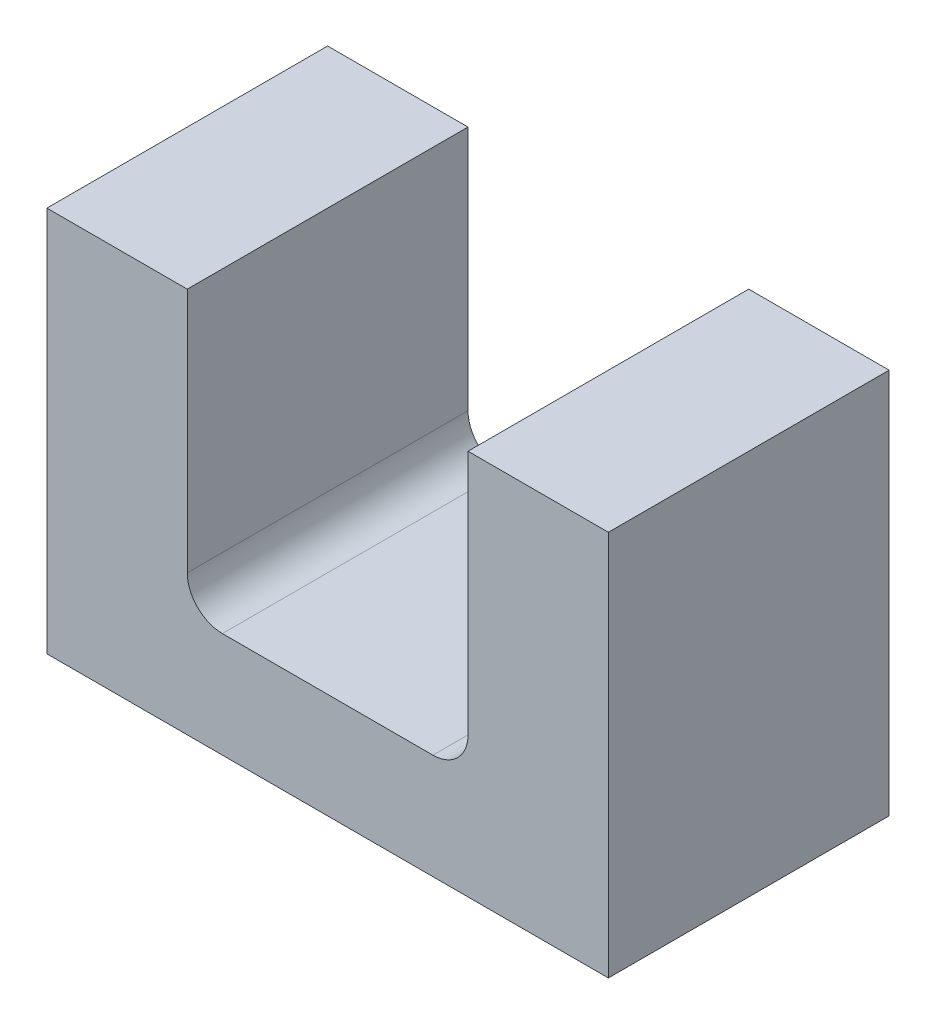
ISO-10303-21;
HEADER;
FILE_DESCRIPTION(('STEP AP214'),'2;1');
FILE_NAME('part.step','',(''),(''),'','','');
FILE_SCHEMA(('AUTOMOTIVE_DESIGN { 1 0 10303 214 1 1 1 1 }'));
ENDSEC;
DATA;
#1=APPLICATION_CONTEXT('core data for automotive mechanical design processes');
#2=APPLICATION_PROTOCOL_DEFINITION('international standard','automotive_design',2000,#1);
#3=PRODUCT_CONTEXT('',#1,'mechanical');
#4=PRODUCT('Part','Part','',(#3));
#5=PRODUCT_RELATED_PRODUCT_CATEGORY('part','',(#4));
#6=PRODUCT_DEFINITION_FORMATION('','',#4);
#7=PRODUCT_DEFINITION_CONTEXT('part definition',#1,'design');
#8=PRODUCT_DEFINITION('design','',#6,#7);
#9=PRODUCT_DEFINITION_SHAPE('','',#8);
#10=(LENGTH_UNIT() NAMED_UNIT(*) SI_UNIT(.MILLI.,.METRE.));
#11=(NAMED_UNIT(*) PLANE_ANGLE_UNIT() SI_UNIT($,.RADIAN.));
#12=(NAMED_UNIT(*) SI_UNIT($,.STERADIAN.) SOLID_ANGLE_UNIT());
#13=UNCERTAINTY_MEASURE_WITH_UNIT(LENGTH_MEASURE(1.E-05),#10,'distance_accuracy_value','');
#14=(GEOMETRIC_REPRESENTATION_CONTEXT(3) GLOBAL_UNCERTAINTY_ASSIGNED_CONTEXT((#13)) GLOBAL_UNIT_ASSIGNED_CONTEXT((#10,
#11,#12)) REPRESENTATION_CONTEXT('',''));
#15=CARTESIAN_POINT('',(0.,0.,0.));
#16=DIRECTION('',(0.,0.,1.));
#17=DIRECTION('',(1.,0.,0.));
#18=AXIS2_PLACEMENT_3D('',#15,#16,#17);
#19=CARTESIAN_POINT('',(-4.,5.5,0.));
#20=DIRECTION('',(1.,0.,0.));
#21=DIRECTION('',(0.,0.,-1.));
#22=AXIS2_PLACEMENT_3D('',#19,#20,#21);
#23=PLANE('',#22);
#24=DIRECTION('',(0.,0.,1.));
#25=VECTOR('',#24,1.);
#26=CARTESIAN_POINT('',(-4.,0.,0.));
#27=LINE('',#26,#25);
#28=CARTESIAN_POINT('',(-4.,0.,-2.));
#29=VERTEX_POINT('',#28);
#30=CARTESIAN_POINT('',(-4.,0.,2.));
#31=VERTEX_POINT('',#30);
#32=EDGE_CURVE('E172',#29,#31,#27,.T.);
#33=ORIENTED_EDGE('',*,*,#32,.T.);
#34=DIRECTION('',(0.,-1.,0.));
#35=VECTOR('',#34,1.);
#36=CARTESIAN_POINT('',(-4.,5.5,2.));
#37=LINE('',#36,#35);
#38=CARTESIAN_POINT('',(-4.,5.5,2.));
#39=VERTEX_POINT('',#38);
#40=EDGE_CURVE('E206',#39,#31,#37,.T.);
#41=ORIENTED_EDGE('',*,*,#40,.F.);
#42=DIRECTION('',(0.,0.,1.));
#43=VECTOR('',#42,1.);
#44=CARTESIAN_POINT('',(-4.,5.5,0.));
#45=LINE('',#44,#43);
#46=CARTESIAN_POINT('',(-4.,5.5,-2.));
#47=VERTEX_POINT('',#46);
#48=EDGE_CURVE('E173',#47,#39,#45,.T.);
#49=ORIENTED_EDGE('',*,*,#48,.F.);
#50=DIRECTION('',(0.,-1.,0.));
#51=VECTOR('',#50,1.);
#52=CARTESIAN_POINT('',(-4.,5.5,-2.));
#53=LINE('',#52,#51);
#54=EDGE_CURVE('E189',#47,#29,#53,.T.);
#55=ORIENTED_EDGE('',*,*,#54,.T.);
#56=EDGE_LOOP('',(#33,#41,#49,#55));
#57=FACE_BOUND('',#56,.T.);
#58=ADVANCED_FACE('F39',(#57),#23,.F.);
#59=CARTESIAN_POINT('',(0.,5.5,2.));
#60=DIRECTION('',(0.,0.,-1.));
#61=DIRECTION('',(-1.,0.,0.));
#62=AXIS2_PLACEMENT_3D('',#59,#60,#61);
#63=PLANE('',#62);
#64=DIRECTION('',(1.,0.,0.));
#65=VECTOR('',#64,1.);
#66=CARTESIAN_POINT('',(0.,0.,2.));
#67=LINE('',#66,#65);
#68=CARTESIAN_POINT('',(4.,0.,2.));
#69=VERTEX_POINT('',#68);
#70=EDGE_CURVE('E193',#31,#69,#67,.T.);
#71=ORIENTED_EDGE('',*,*,#70,.T.);
#72=DIRECTION('',(0.,-1.,0.));
#73=VECTOR('',#72,1.);
#74=CARTESIAN_POINT('',(4.,5.5,2.));
#75=LINE('',#74,#73);
#76=CARTESIAN_POINT('',(4.,5.5,2.));
#77=VERTEX_POINT('',#76);
#78=EDGE_CURVE('E160',#77,#69,#75,.T.);
#79=ORIENTED_EDGE('',*,*,#78,.F.);
#80=DIRECTION('',(1.,0.,0.));
#81=VECTOR('',#80,1.);
#82=CARTESIAN_POINT('',(0.,5.5,2.));
#83=LINE('',#82,#81);
#84=CARTESIAN_POINT('',(2.,5.5,2.));
#85=VERTEX_POINT('',#84);
#86=EDGE_CURVE('E141',#85,#77,#83,.T.);
#87=ORIENTED_EDGE('',*,*,#86,.F.);
#88=DIRECTION('',(0.,-1.,0.));
#89=VECTOR('',#88,1.);
#90=CARTESIAN_POINT('',(2.,5.5,2.));
#91=LINE('',#90,#89);
#92=CARTESIAN_POINT('',(2.,2.,2.));
#93=VERTEX_POINT('',#92);
#94=EDGE_CURVE('E132',#85,#93,#91,.T.);
#95=ORIENTED_EDGE('',*,*,#94,.T.);
#96=CARTESIAN_POINT('',(1.5,2.,2.));
#97=DIRECTION('',(0.,0.,-1.));
#98=DIRECTION('',(-1.,0.,0.));
#99=AXIS2_PLACEMENT_3D('',#96,#97,#98);
#100=CIRCLE('',#99,0.5);
#101=CARTESIAN_POINT('',(1.5,1.5,2.));
#102=VERTEX_POINT('',#101);
#103=EDGE_CURVE('E222',#93,#102,#100,.T.);
#104=ORIENTED_EDGE('',*,*,#103,.T.);
#105=DIRECTION('',(1.,0.,0.));
#106=VECTOR('',#105,1.);
#107=CARTESIAN_POINT('',(0.,1.5,2.));
#108=LINE('',#107,#106);
#109=CARTESIAN_POINT('',(-1.5,1.5,2.));
#110=VERTEX_POINT('',#109);
#111=EDGE_CURVE('E168',#110,#102,#108,.T.);
#112=ORIENTED_EDGE('',*,*,#111,.F.);
#113=CARTESIAN_POINT('',(-1.5,2.,2.));
#114=DIRECTION('',(0.,0.,-1.));
#115=DIRECTION('',(-1.,0.,0.));
#116=AXIS2_PLACEMENT_3D('',#113,#114,#115);
#117=CIRCLE('',#116,0.5);
#118=CARTESIAN_POINT('',(-2.,2.,2.));
#119=VERTEX_POINT('',#118);
#120=EDGE_CURVE('E48',#110,#119,#117,.T.);
#121=ORIENTED_EDGE('',*,*,#120,.T.);
#122=DIRECTION('',(0.,-1.,0.));
#123=VECTOR('',#122,1.);
#124=CARTESIAN_POINT('',(-2.,5.5,2.));
#125=LINE('',#124,#123);
#126=CARTESIAN_POINT('',(-2.,5.5,2.));
#127=VERTEX_POINT('',#126);
#128=EDGE_CURVE('E203',#127,#119,#125,.T.);
#129=ORIENTED_EDGE('',*,*,#128,.F.);
#130=DIRECTION('',(1.,0.,0.));
#131=VECTOR('',#130,1.);
#132=CARTESIAN_POINT('',(0.,5.5,2.));
#133=LINE('',#132,#131);
#134=EDGE_CURVE('E177',#39,#127,#133,.T.);
#135=ORIENTED_EDGE('',*,*,#134,.F.);
#136=ORIENTED_EDGE('',*,*,#40,.T.);
#137=EDGE_LOOP('',(#71,#79,#87,#95,#104,#112,#121,#129,#135,#136));
#138=FACE_BOUND('',#137,.T.);
#139=ADVANCED_FACE('F227',(#138),#63,.F.);
#140=CARTESIAN_POINT('',(-2.,5.5,0.));
#141=DIRECTION('',(1.,0.,0.));
#142=DIRECTION('',(0.,0.,-1.));
#143=AXIS2_PLACEMENT_3D('',#140,#141,#142);
#144=PLANE('',#143);
#145=ORIENTED_EDGE('',*,*,#128,.T.);
#146=DIRECTION('',(0.,0.,1.));
#147=VECTOR('',#146,1.);
#148=CARTESIAN_POINT('',(-2.,2.,-2.));
#149=LINE('',#148,#147);
#150=CARTESIAN_POINT('',(-2.,2.,-2.));
#151=VERTEX_POINT('',#150);
#152=EDGE_CURVE('E61',#119,#151,#149,.F.);
#153=ORIENTED_EDGE('',*,*,#152,.T.);
#154=DIRECTION('',(0.,-1.,0.));
#155=VECTOR('',#154,1.);
#156=CARTESIAN_POINT('',(-2.,5.5,-2.));
#157=LINE('',#156,#155);
#158=CARTESIAN_POINT('',(-2.,5.5,-2.));
#159=VERTEX_POINT('',#158);
#160=EDGE_CURVE('E200',#159,#151,#157,.T.);
#161=ORIENTED_EDGE('',*,*,#160,.F.);
#162=DIRECTION('',(0.,0.,1.));
#163=VECTOR('',#162,1.);
#164=CARTESIAN_POINT('',(-2.,5.5,0.));
#165=LINE('',#164,#163);
#166=EDGE_CURVE('E181',#159,#127,#165,.T.);
#167=ORIENTED_EDGE('',*,*,#166,.T.);
#168=EDGE_LOOP('',(#145,#153,#161,#167));
#169=FACE_BOUND('',#168,.T.);
#170=ADVANCED_FACE('F249',(#169),#144,.T.);
#171=CARTESIAN_POINT('',(0.,5.5,-2.));
#172=DIRECTION('',(0.,0.,-1.));
#173=DIRECTION('',(-1.,0.,0.));
#174=AXIS2_PLACEMENT_3D('',#171,#172,#173);
#175=PLANE('',#174);
#176=DIRECTION('',(1.,0.,0.));
#177=VECTOR('',#176,1.);
#178=CARTESIAN_POINT('',(0.,0.,-2.));
#179=LINE('',#178,#177);
#180=CARTESIAN_POINT('',(4.,0.,-2.));
#181=VERTEX_POINT('',#180);
#182=EDGE_CURVE('E178',#29,#181,#179,.T.);
#183=ORIENTED_EDGE('',*,*,#182,.F.);
#184=ORIENTED_EDGE('',*,*,#54,.F.);
#185=DIRECTION('',(1.,0.,0.));
#186=VECTOR('',#185,1.);
#187=CARTESIAN_POINT('',(0.,5.5,-2.));
#188=LINE('',#187,#186);
#189=EDGE_CURVE('E185',#47,#159,#188,.T.);
#190=ORIENTED_EDGE('',*,*,#189,.T.);
#191=ORIENTED_EDGE('',*,*,#160,.T.);
#192=CARTESIAN_POINT('',(-1.5,2.,-2.));
#193=DIRECTION('',(0.,0.,-1.));
#194=DIRECTION('',(-1.,0.,0.));
#195=AXIS2_PLACEMENT_3D('',#192,#193,#194);
#196=CIRCLE('',#195,0.5);
#197=CARTESIAN_POINT('',(-1.5,1.5,-2.));
#198=VERTEX_POINT('',#197);
#199=EDGE_CURVE('E11',#151,#198,#196,.F.);
#200=ORIENTED_EDGE('',*,*,#199,.T.);
#201=DIRECTION('',(1.,0.,0.));
#202=VECTOR('',#201,1.);
#203=CARTESIAN_POINT('',(0.,1.5,-2.));
#204=LINE('',#203,#202);
#205=CARTESIAN_POINT('',(1.5,1.5,-2.));
#206=VERTEX_POINT('',#205);
#207=EDGE_CURVE('E131',#198,#206,#204,.T.);
#208=ORIENTED_EDGE('',*,*,#207,.T.);
#209=CARTESIAN_POINT('',(1.5,2.,-2.));
#210=DIRECTION('',(0.,0.,-1.));
#211=DIRECTION('',(-1.,0.,0.));
#212=AXIS2_PLACEMENT_3D('',#209,#210,#211);
#213=CIRCLE('',#212,0.5);
#214=CARTESIAN_POINT('',(2.,2.,-2.));
#215=VERTEX_POINT('',#214);
#216=EDGE_CURVE('E126',#206,#215,#213,.F.);
#217=ORIENTED_EDGE('',*,*,#216,.T.);
#218=DIRECTION('',(0.,-1.,0.));
#219=VECTOR('',#218,1.);
#220=CARTESIAN_POINT('',(2.,5.5,-2.));
#221=LINE('',#220,#219);
#222=CARTESIAN_POINT('',(2.,5.5,-2.));
#223=VERTEX_POINT('',#222);
#224=EDGE_CURVE('E116',#223,#215,#221,.T.);
#225=ORIENTED_EDGE('',*,*,#224,.F.);
#226=DIRECTION('',(1.,0.,0.));
#227=VECTOR('',#226,1.);
#228=CARTESIAN_POINT('',(0.,5.5,-2.));
#229=LINE('',#228,#227);
#230=CARTESIAN_POINT('',(4.,5.5,-2.));
#231=VERTEX_POINT('',#230);
#232=EDGE_CURVE('E122',#223,#231,#229,.T.);
#233=ORIENTED_EDGE('',*,*,#232,.T.);
#234=DIRECTION('',(0.,-1.,0.));
#235=VECTOR('',#234,1.);
#236=CARTESIAN_POINT('',(4.,5.5,-2.));
#237=LINE('',#236,#235);
#238=EDGE_CURVE('E156',#231,#181,#237,.T.);
#239=ORIENTED_EDGE('',*,*,#238,.T.);
#240=EDGE_LOOP('',(#183,#184,#190,#191,#200,#208,#217,#225,#233,#239));
#241=FACE_BOUND('',#240,.T.);
#242=ADVANCED_FACE('F119',(#241),#175,.T.);
#243=CARTESIAN_POINT('',(0.,5.5,0.));
#244=DIRECTION('',(0.,1.,0.));
#245=DIRECTION('',(0.,0.,1.));
#246=AXIS2_PLACEMENT_3D('',#243,#244,#245);
#247=PLANE('',#246);
#248=ORIENTED_EDGE('',*,*,#48,.T.);
#249=ORIENTED_EDGE('',*,*,#134,.T.);
#250=ORIENTED_EDGE('',*,*,#166,.F.);
#251=ORIENTED_EDGE('',*,*,#189,.F.);
#252=EDGE_LOOP('',(#248,#249,#250,#251));
#253=FACE_BOUND('',#252,.T.);
#254=ADVANCED_FACE('F256',(#253),#247,.T.);
#255=CARTESIAN_POINT('',(0.,0.,0.));
#256=DIRECTION('',(0.,1.,0.));
#257=DIRECTION('',(0.,0.,1.));
#258=AXIS2_PLACEMENT_3D('',#255,#256,#257);
#259=PLANE('',#258);
#260=ORIENTED_EDGE('',*,*,#32,.F.);
#261=ORIENTED_EDGE('',*,*,#182,.T.);
#262=DIRECTION('',(0.,0.,1.));
#263=VECTOR('',#262,1.);
#264=CARTESIAN_POINT('',(4.,0.,0.));
#265=LINE('',#264,#263);
#266=EDGE_CURVE('E147',#181,#69,#265,.T.);
#267=ORIENTED_EDGE('',*,*,#266,.T.);
#268=ORIENTED_EDGE('',*,*,#70,.F.);
#269=EDGE_LOOP('',(#260,#261,#267,#268));
#270=FACE_BOUND('',#269,.T.);
#271=ADVANCED_FACE('F257',(#270),#259,.F.);
#272=CARTESIAN_POINT('',(0.,1.5,0.));
#273=DIRECTION('',(0.,1.,0.));
#274=DIRECTION('',(0.,0.,1.));
#275=AXIS2_PLACEMENT_3D('',#272,#273,#274);
#276=PLANE('',#275);
#277=ORIENTED_EDGE('',*,*,#111,.T.);
#278=DIRECTION('',(0.,0.,1.));
#279=VECTOR('',#278,1.);
#280=CARTESIAN_POINT('',(1.5,1.5,0.));
#281=LINE('',#280,#279);
#282=EDGE_CURVE('E217',#102,#206,#281,.F.);
#283=ORIENTED_EDGE('',*,*,#282,.T.);
#284=ORIENTED_EDGE('',*,*,#207,.F.);
#285=DIRECTION('',(0.,0.,1.));
#286=VECTOR('',#285,1.);
#287=CARTESIAN_POINT('',(-1.5,1.5,2.));
#288=LINE('',#287,#286);
#289=EDGE_CURVE('E213',#198,#110,#288,.T.);
#290=ORIENTED_EDGE('',*,*,#289,.T.);
#291=EDGE_LOOP('',(#277,#283,#284,#290));
#292=FACE_BOUND('',#291,.T.);
#293=ADVANCED_FACE('F231',(#292),#276,.T.);
#294=CARTESIAN_POINT('',(2.,5.5,0.));
#295=DIRECTION('',(1.,0.,0.));
#296=DIRECTION('',(0.,0.,-1.));
#297=AXIS2_PLACEMENT_3D('',#294,#295,#296);
#298=PLANE('',#297);
#299=ORIENTED_EDGE('',*,*,#224,.T.);
#300=DIRECTION('',(0.,0.,1.));
#301=VECTOR('',#300,1.);
#302=CARTESIAN_POINT('',(2.,2.,0.));
#303=LINE('',#302,#301);
#304=EDGE_CURVE('E210',#215,#93,#303,.T.);
#305=ORIENTED_EDGE('',*,*,#304,.T.);
#306=ORIENTED_EDGE('',*,*,#94,.F.);
#307=DIRECTION('',(0.,0.,1.));
#308=VECTOR('',#307,1.);
#309=CARTESIAN_POINT('',(2.,5.5,0.));
#310=LINE('',#309,#308);
#311=EDGE_CURVE('E135',#223,#85,#310,.T.);
#312=ORIENTED_EDGE('',*,*,#311,.F.);
#313=EDGE_LOOP('',(#299,#305,#306,#312));
#314=FACE_BOUND('',#313,.T.);
#315=ADVANCED_FACE('F136',(#314),#298,.F.);
#316=CARTESIAN_POINT('',(4.,5.5,0.));
#317=DIRECTION('',(1.,0.,0.));
#318=DIRECTION('',(0.,0.,-1.));
#319=AXIS2_PLACEMENT_3D('',#316,#317,#318);
#320=PLANE('',#319);
#321=ORIENTED_EDGE('',*,*,#266,.F.);
#322=ORIENTED_EDGE('',*,*,#238,.F.);
#323=DIRECTION('',(0.,0.,1.));
#324=VECTOR('',#323,1.);
#325=CARTESIAN_POINT('',(4.,5.5,0.));
#326=LINE('',#325,#324);
#327=EDGE_CURVE('E145',#231,#77,#326,.T.);
#328=ORIENTED_EDGE('',*,*,#327,.T.);
#329=ORIENTED_EDGE('',*,*,#78,.T.);
#330=EDGE_LOOP('',(#321,#322,#328,#329));
#331=FACE_BOUND('',#330,.T.);
#332=ADVANCED_FACE('F241',(#331),#320,.T.);
#333=CARTESIAN_POINT('',(0.,5.5,0.));
#334=DIRECTION('',(0.,1.,0.));
#335=DIRECTION('',(0.,0.,1.));
#336=AXIS2_PLACEMENT_3D('',#333,#334,#335);
#337=PLANE('',#336);
#338=ORIENTED_EDGE('',*,*,#232,.F.);
#339=ORIENTED_EDGE('',*,*,#311,.T.);
#340=ORIENTED_EDGE('',*,*,#86,.T.);
#341=ORIENTED_EDGE('',*,*,#327,.F.);
#342=EDGE_LOOP('',(#338,#339,#340,#341));
#343=FACE_BOUND('',#342,.T.);
#344=ADVANCED_FACE('F143',(#343),#337,.T.);
#345=CARTESIAN_POINT('',(1.5,2.,0.));
#346=DIRECTION('',(0.,0.,1.));
#347=DIRECTION('',(1.,0.,0.));
#348=AXIS2_PLACEMENT_3D('',#345,#346,#347);
#349=CYLINDRICAL_SURFACE('',#348,0.5);
#350=ORIENTED_EDGE('',*,*,#216,.F.);
#351=ORIENTED_EDGE('',*,*,#282,.F.);
#352=ORIENTED_EDGE('',*,*,#103,.F.);
#353=ORIENTED_EDGE('',*,*,#304,.F.);
#354=EDGE_LOOP('',(#350,#351,#352,#353));
#355=FACE_BOUND('',#354,.T.);
#356=ADVANCED_FACE('F234',(#355),#349,.F.);
#357=CARTESIAN_POINT('',(-1.5,2.,0.));
#358=DIRECTION('',(0.,0.,-1.));
#359=DIRECTION('',(-1.,0.,0.));
#360=AXIS2_PLACEMENT_3D('',#357,#358,#359);
#361=CYLINDRICAL_SURFACE('',#360,0.5);
#362=ORIENTED_EDGE('',*,*,#199,.F.);
#363=ORIENTED_EDGE('',*,*,#152,.F.);
#364=ORIENTED_EDGE('',*,*,#120,.F.);
#365=ORIENTED_EDGE('',*,*,#289,.F.);
#366=EDGE_LOOP('',(#362,#363,#364,#365));
#367=FACE_BOUND('',#366,.T.);
#368=ADVANCED_FACE('F41',(#367),#361,.F.);
#369=CLOSED_SHELL('',(#58,#139,#170,#242,#254,#271,#293,#315,#332,#344,#356,#368));
#370=MANIFOLD_SOLID_BREP('B2',#369);
#371=ADVANCED_BREP_SHAPE_REPRESENTATION('',(#18,#370),#14);
#372=SHAPE_DEFINITION_REPRESENTATION(#9,#371);
ENDSEC;
END-ISO-10303-21;
